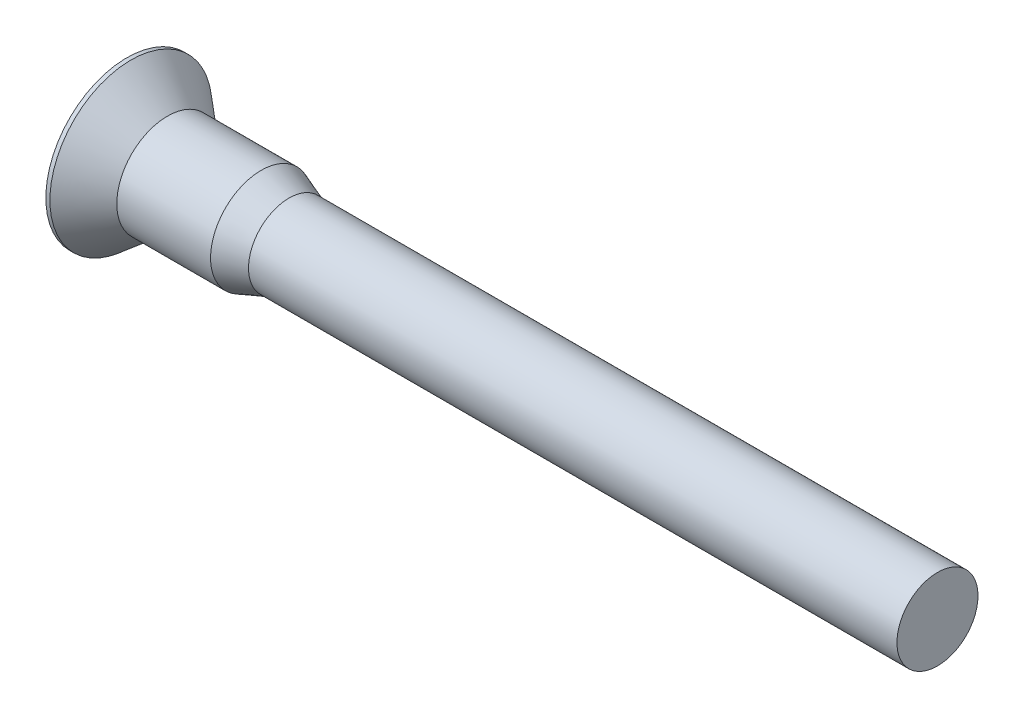
ISO-10303-21;
HEADER;
FILE_DESCRIPTION(('STEP AP214'),'2;1');
FILE_NAME('part.step','',(''),(''),'','','');
FILE_SCHEMA(('AUTOMOTIVE_DESIGN { 1 0 10303 214 1 1 1 1 }'));
ENDSEC;
DATA;
#1=APPLICATION_CONTEXT('core data for automotive mechanical design processes');
#2=APPLICATION_PROTOCOL_DEFINITION('international standard','automotive_design',2000,#1);
#3=PRODUCT_CONTEXT('',#1,'mechanical');
#4=PRODUCT('Part','Part','',(#3));
#5=PRODUCT_RELATED_PRODUCT_CATEGORY('part','',(#4));
#6=PRODUCT_DEFINITION_FORMATION('','',#4);
#7=PRODUCT_DEFINITION_CONTEXT('part definition',#1,'design');
#8=PRODUCT_DEFINITION('design','',#6,#7);
#9=PRODUCT_DEFINITION_SHAPE('','',#8);
#10=(LENGTH_UNIT() NAMED_UNIT(*) SI_UNIT(.MILLI.,.METRE.));
#11=(NAMED_UNIT(*) PLANE_ANGLE_UNIT() SI_UNIT($,.RADIAN.));
#12=(NAMED_UNIT(*) SI_UNIT($,.STERADIAN.) SOLID_ANGLE_UNIT());
#13=UNCERTAINTY_MEASURE_WITH_UNIT(LENGTH_MEASURE(1.E-05),#10,'distance_accuracy_value','');
#14=(GEOMETRIC_REPRESENTATION_CONTEXT(3) GLOBAL_UNCERTAINTY_ASSIGNED_CONTEXT((#13)) GLOBAL_UNIT_ASSIGNED_CONTEXT((#10,
#11,#12)) REPRESENTATION_CONTEXT('',''));
#15=CARTESIAN_POINT('',(0.,0.,0.));
#16=DIRECTION('',(0.,0.,1.));
#17=DIRECTION('',(1.,0.,0.));
#18=AXIS2_PLACEMENT_3D('',#15,#16,#17);
#19=CARTESIAN_POINT('',(0.,0.,0.));
#20=DIRECTION('',(-1.,0.,0.));
#21=DIRECTION('',(0.,0.,1.));
#22=AXIS2_PLACEMENT_3D('',#19,#20,#21);
#23=PLANE('',#22);
#24=DIRECTION('',(0.,0.999940500924261,-0.010908465122929));
#25=VECTOR('',#24,1.);
#26=CARTESIAN_POINT('',(0.,-1.13281490451861,2.01247701239886));
#27=LINE('',#26,#25);
#28=CARTESIAN_POINT('',(0.,-1.13281490451861,2.01247701239886));
#29=VERTEX_POINT('',#28);
#30=CARTESIAN_POINT('',(0.,1.17644876501032,1.98728499129818));
#31=VERTEX_POINT('',#30);
#32=EDGE_CURVE('E47',#29,#31,#27,.T.);
#33=ORIENTED_EDGE('',*,*,#32,.F.);
#34=DIRECTION('',(0.,0.509417258374883,0.860519643511883));
#35=VECTOR('',#34,1.);
#36=CARTESIAN_POINT('',(0.,-2.30926366952893,0.025192021100675));
#37=LINE('',#36,#35);
#38=CARTESIAN_POINT('',(0.,-2.30926366952893,0.025192021100675));
#39=VERTEX_POINT('',#38);
#40=EDGE_CURVE('E130',#39,#29,#37,.T.);
#41=ORIENTED_EDGE('',*,*,#40,.F.);
#42=DIRECTION('',(0.,-0.490523242549378,0.871428108634811));
#43=VECTOR('',#42,1.);
#44=CARTESIAN_POINT('',(0.,-1.17644876501032,-1.98728499129818));
#45=LINE('',#44,#43);
#46=CARTESIAN_POINT('',(0.,-1.17644876501032,-1.98728499129818));
#47=VERTEX_POINT('',#46);
#48=EDGE_CURVE('E128',#47,#39,#45,.T.);
#49=ORIENTED_EDGE('',*,*,#48,.F.);
#50=DIRECTION('',(0.,-0.999940500924261,0.0109084651229286));
#51=VECTOR('',#50,1.);
#52=CARTESIAN_POINT('',(0.,1.13281490451861,-2.01247701239886));
#53=LINE('',#52,#51);
#54=CARTESIAN_POINT('',(0.,1.13281490451861,-2.01247701239886));
#55=VERTEX_POINT('',#54);
#56=EDGE_CURVE('E95',#55,#47,#53,.T.);
#57=ORIENTED_EDGE('',*,*,#56,.F.);
#58=DIRECTION('',(0.,-0.509417258374883,-0.860519643511883));
#59=VECTOR('',#58,1.);
#60=CARTESIAN_POINT('',(0.,2.30926366952893,-0.0251920211006729));
#61=LINE('',#60,#59);
#62=CARTESIAN_POINT('',(0.,2.30926366952893,-0.0251920211006729));
#63=VERTEX_POINT('',#62);
#64=EDGE_CURVE('E124',#63,#55,#61,.T.);
#65=ORIENTED_EDGE('',*,*,#64,.F.);
#66=DIRECTION('',(0.,0.490523242549378,-0.871428108634811));
#67=VECTOR('',#66,1.);
#68=CARTESIAN_POINT('',(0.,1.17644876501032,1.98728499129818));
#69=LINE('',#68,#67);
#70=EDGE_CURVE('E121',#31,#63,#69,.T.);
#71=ORIENTED_EDGE('',*,*,#70,.F.);
#72=EDGE_LOOP('',(#33,#41,#49,#57,#65,#71));
#73=FACE_BOUND('',#72,.T.);
#74=CARTESIAN_POINT('',(0.,0.,0.));
#75=DIRECTION('',(1.,0.,0.));
#76=DIRECTION('',(0.,0.,-1.));
#77=AXIS2_PLACEMENT_3D('',#74,#75,#76);
#78=CIRCLE('',#77,4.);
#79=CARTESIAN_POINT('',(0.,0.,-4.));
#80=VERTEX_POINT('',#79);
#81=EDGE_CURVE('E11',#80,#80,#78,.T.);
#82=ORIENTED_EDGE('',*,*,#81,.F.);
#83=EDGE_LOOP('',(#82));
#84=FACE_BOUND('',#83,.T.);
#85=ADVANCED_FACE('F33',(#73,#84),#23,.T.);
#86=CARTESIAN_POINT('',(40.,0.,0.));
#87=DIRECTION('',(1.,0.,0.));
#88=DIRECTION('',(0.,0.,-1.));
#89=AXIS2_PLACEMENT_3D('',#86,#87,#88);
#90=CYLINDRICAL_SURFACE('',#89,4.);
#91=ORIENTED_EDGE('',*,*,#81,.T.);
#92=EDGE_LOOP('',(#91));
#93=FACE_BOUND('',#92,.T.);
#94=CARTESIAN_POINT('',(0.199999999999999,0.,0.));
#95=DIRECTION('',(1.,0.,0.));
#96=DIRECTION('',(0.,0.,-1.));
#97=AXIS2_PLACEMENT_3D('',#94,#95,#96);
#98=CIRCLE('',#97,4.);
#99=CARTESIAN_POINT('',(0.199999999999999,0.,-4.));
#100=VERTEX_POINT('',#99);
#101=EDGE_CURVE('E40',#100,#100,#98,.T.);
#102=ORIENTED_EDGE('',*,*,#101,.F.);
#103=EDGE_LOOP('',(#102));
#104=FACE_BOUND('',#103,.T.);
#105=ADVANCED_FACE('F156',(#93,#104),#90,.T.);
#106=CARTESIAN_POINT('',(2.,0.,0.));
#107=DIRECTION('',(-1.,0.,0.));
#108=DIRECTION('',(0.,0.,1.));
#109=AXIS2_PLACEMENT_3D('',#106,#107,#108);
#110=CONICAL_SURFACE('',#109,2.5,0.694738276196704);
#111=ORIENTED_EDGE('',*,*,#101,.T.);
#112=EDGE_LOOP('',(#111));
#113=FACE_BOUND('',#112,.T.);
#114=CARTESIAN_POINT('',(2.,0.,0.));
#115=DIRECTION('',(1.,0.,0.));
#116=DIRECTION('',(0.,0.,-1.));
#117=AXIS2_PLACEMENT_3D('',#114,#115,#116);
#118=CIRCLE('',#117,2.5);
#119=CARTESIAN_POINT('',(2.,0.,-2.5));
#120=VERTEX_POINT('',#119);
#121=EDGE_CURVE('E148',#120,#120,#118,.T.);
#122=ORIENTED_EDGE('',*,*,#121,.F.);
#123=EDGE_LOOP('',(#122));
#124=FACE_BOUND('',#123,.T.);
#125=ADVANCED_FACE('F153',(#113,#124),#110,.T.);
#126=CARTESIAN_POINT('',(40.,0.,0.));
#127=DIRECTION('',(1.,0.,0.));
#128=DIRECTION('',(0.,0.,-1.));
#129=AXIS2_PLACEMENT_3D('',#126,#127,#128);
#130=CYLINDRICAL_SURFACE('',#129,2.5);
#131=ORIENTED_EDGE('',*,*,#121,.T.);
#132=EDGE_LOOP('',(#131));
#133=FACE_BOUND('',#132,.T.);
#134=CARTESIAN_POINT('',(6.62767782195317,0.,0.));
#135=DIRECTION('',(1.,0.,0.));
#136=DIRECTION('',(0.,0.,-1.));
#137=AXIS2_PLACEMENT_3D('',#134,#135,#136);
#138=CIRCLE('',#137,2.5);
#139=CARTESIAN_POINT('',(6.62767782195317,0.,-2.5));
#140=VERTEX_POINT('',#139);
#141=EDGE_CURVE('E145',#140,#140,#138,.T.);
#142=ORIENTED_EDGE('',*,*,#141,.F.);
#143=EDGE_LOOP('',(#142));
#144=FACE_BOUND('',#143,.T.);
#145=ADVANCED_FACE('F163',(#133,#144),#130,.T.);
#146=CARTESIAN_POINT('',(8.,0.,0.));
#147=DIRECTION('',(-1.,0.,0.));
#148=DIRECTION('',(0.,0.,1.));
#149=AXIS2_PLACEMENT_3D('',#146,#147,#148);
#150=CONICAL_SURFACE('',#149,2.,0.349397557874134);
#151=ORIENTED_EDGE('',*,*,#141,.T.);
#152=EDGE_LOOP('',(#151));
#153=FACE_BOUND('',#152,.T.);
#154=CARTESIAN_POINT('',(8.,0.,0.));
#155=DIRECTION('',(1.,0.,0.));
#156=DIRECTION('',(0.,0.,-1.));
#157=AXIS2_PLACEMENT_3D('',#154,#155,#156);
#158=CIRCLE('',#157,2.);
#159=CARTESIAN_POINT('',(8.,0.,-2.));
#160=VERTEX_POINT('',#159);
#161=EDGE_CURVE('E142',#160,#160,#158,.T.);
#162=ORIENTED_EDGE('',*,*,#161,.F.);
#163=EDGE_LOOP('',(#162));
#164=FACE_BOUND('',#163,.T.);
#165=ADVANCED_FACE('F169',(#153,#164),#150,.T.);
#166=CARTESIAN_POINT('',(40.,0.,0.));
#167=DIRECTION('',(1.,0.,0.));
#168=DIRECTION('',(0.,0.,-1.));
#169=AXIS2_PLACEMENT_3D('',#166,#167,#168);
#170=CYLINDRICAL_SURFACE('',#169,2.);
#171=ORIENTED_EDGE('',*,*,#161,.T.);
#172=EDGE_LOOP('',(#171));
#173=FACE_BOUND('',#172,.T.);
#174=CARTESIAN_POINT('',(40.,0.,0.));
#175=DIRECTION('',(1.,0.,0.));
#176=DIRECTION('',(0.,0.,-1.));
#177=AXIS2_PLACEMENT_3D('',#174,#175,#176);
#178=CIRCLE('',#177,2.);
#179=CARTESIAN_POINT('',(40.,0.,-2.));
#180=VERTEX_POINT('',#179);
#181=EDGE_CURVE('E134',#180,#180,#178,.T.);
#182=ORIENTED_EDGE('',*,*,#181,.F.);
#183=EDGE_LOOP('',(#182));
#184=FACE_BOUND('',#183,.T.);
#185=ADVANCED_FACE('F173',(#173,#184),#170,.T.);
#186=CARTESIAN_POINT('',(40.,0.,-2.));
#187=DIRECTION('',(1.,0.,0.));
#188=DIRECTION('',(0.,0.,-1.));
#189=AXIS2_PLACEMENT_3D('',#186,#187,#188);
#190=PLANE('',#189);
#191=ORIENTED_EDGE('',*,*,#181,.T.);
#192=EDGE_LOOP('',(#191));
#193=FACE_BOUND('',#192,.T.);
#194=ADVANCED_FACE('F177',(#193),#190,.T.);
#195=CARTESIAN_POINT('',(2.,-1.13281490451861,2.01247701239886));
#196=DIRECTION('',(0.,0.010908465122929,0.999940500924261));
#197=DIRECTION('',(0.,-0.999940500924261,0.010908465122929));
#198=AXIS2_PLACEMENT_3D('',#195,#196,#197);
#199=PLANE('',#198);
#200=ORIENTED_EDGE('',*,*,#32,.T.);
#201=DIRECTION('',(-1.,0.,0.));
#202=VECTOR('',#201,1.);
#203=CARTESIAN_POINT('',(2.,1.17644876501032,1.98728499129818));
#204=LINE('',#203,#202);
#205=CARTESIAN_POINT('',(2.,1.17644876501032,1.98728499129818));
#206=VERTEX_POINT('',#205);
#207=EDGE_CURVE('E77',#206,#31,#204,.T.);
#208=ORIENTED_EDGE('',*,*,#207,.F.);
#209=DIRECTION('',(0.,0.999940500924261,-0.010908465122929));
#210=VECTOR('',#209,1.);
#211=CARTESIAN_POINT('',(2.,-1.13281490451861,2.01247701239886));
#212=LINE('',#211,#210);
#213=CARTESIAN_POINT('',(2.,-1.13281490451861,2.01247701239886));
#214=VERTEX_POINT('',#213);
#215=EDGE_CURVE('E132',#214,#206,#212,.T.);
#216=ORIENTED_EDGE('',*,*,#215,.F.);
#217=DIRECTION('',(-1.,0.,0.));
#218=VECTOR('',#217,1.);
#219=CARTESIAN_POINT('',(2.,-1.13281490451861,2.01247701239886));
#220=LINE('',#219,#218);
#221=EDGE_CURVE('E55',#214,#29,#220,.T.);
#222=ORIENTED_EDGE('',*,*,#221,.T.);
#223=EDGE_LOOP('',(#200,#208,#216,#222));
#224=FACE_BOUND('',#223,.T.);
#225=ADVANCED_FACE('F181',(#224),#199,.F.);
#226=CARTESIAN_POINT('',(2.,-2.30926366952893,0.0251920211006748));
#227=DIRECTION('',(0.,-0.860519643511883,0.509417258374883));
#228=DIRECTION('',(0.,-0.509417258374883,-0.860519643511883));
#229=AXIS2_PLACEMENT_3D('',#226,#227,#228);
#230=PLANE('',#229);
#231=ORIENTED_EDGE('',*,*,#40,.T.);
#232=ORIENTED_EDGE('',*,*,#221,.F.);
#233=DIRECTION('',(0.,0.509417258374883,0.860519643511883));
#234=VECTOR('',#233,1.);
#235=CARTESIAN_POINT('',(2.,-2.30926366952893,0.0251920211006748));
#236=LINE('',#235,#234);
#237=CARTESIAN_POINT('',(2.,-2.30926366952893,0.0251920211006748));
#238=VERTEX_POINT('',#237);
#239=EDGE_CURVE('E107',#238,#214,#236,.T.);
#240=ORIENTED_EDGE('',*,*,#239,.F.);
#241=DIRECTION('',(-1.,0.,0.));
#242=VECTOR('',#241,1.);
#243=CARTESIAN_POINT('',(2.,-2.30926366952893,0.0251920211006748));
#244=LINE('',#243,#242);
#245=EDGE_CURVE('E99',#238,#39,#244,.T.);
#246=ORIENTED_EDGE('',*,*,#245,.T.);
#247=EDGE_LOOP('',(#231,#232,#240,#246));
#248=FACE_BOUND('',#247,.T.);
#249=ADVANCED_FACE('F185',(#248),#230,.F.);
#250=CARTESIAN_POINT('',(2.,-1.17644876501032,-1.98728499129818));
#251=DIRECTION('',(0.,-0.871428108634811,-0.490523242549378));
#252=DIRECTION('',(0.,0.490523242549378,-0.871428108634811));
#253=AXIS2_PLACEMENT_3D('',#250,#251,#252);
#254=PLANE('',#253);
#255=ORIENTED_EDGE('',*,*,#48,.T.);
#256=ORIENTED_EDGE('',*,*,#245,.F.);
#257=DIRECTION('',(0.,-0.490523242549378,0.871428108634811));
#258=VECTOR('',#257,1.);
#259=CARTESIAN_POINT('',(2.,-1.17644876501032,-1.98728499129818));
#260=LINE('',#259,#258);
#261=CARTESIAN_POINT('',(2.,-1.17644876501032,-1.98728499129818));
#262=VERTEX_POINT('',#261);
#263=EDGE_CURVE('E103',#262,#238,#260,.T.);
#264=ORIENTED_EDGE('',*,*,#263,.F.);
#265=DIRECTION('',(-1.,0.,0.));
#266=VECTOR('',#265,1.);
#267=CARTESIAN_POINT('',(2.,-1.17644876501032,-1.98728499129818));
#268=LINE('',#267,#266);
#269=EDGE_CURVE('E88',#262,#47,#268,.T.);
#270=ORIENTED_EDGE('',*,*,#269,.T.);
#271=EDGE_LOOP('',(#255,#256,#264,#270));
#272=FACE_BOUND('',#271,.T.);
#273=ADVANCED_FACE('F104',(#272),#254,.F.);
#274=CARTESIAN_POINT('',(2.,1.13281490451861,-2.01247701239886));
#275=DIRECTION('',(0.,-0.0109084651229286,-0.999940500924261));
#276=DIRECTION('',(0.,0.999940500924261,-0.0109084651229286));
#277=AXIS2_PLACEMENT_3D('',#274,#275,#276);
#278=PLANE('',#277);
#279=ORIENTED_EDGE('',*,*,#56,.T.);
#280=ORIENTED_EDGE('',*,*,#269,.F.);
#281=DIRECTION('',(0.,-0.999940500924261,0.0109084651229286));
#282=VECTOR('',#281,1.);
#283=CARTESIAN_POINT('',(2.,1.13281490451861,-2.01247701239886));
#284=LINE('',#283,#282);
#285=CARTESIAN_POINT('',(2.,1.13281490451861,-2.01247701239886));
#286=VERTEX_POINT('',#285);
#287=EDGE_CURVE('E92',#286,#262,#284,.T.);
#288=ORIENTED_EDGE('',*,*,#287,.F.);
#289=DIRECTION('',(-1.,0.,0.));
#290=VECTOR('',#289,1.);
#291=CARTESIAN_POINT('',(2.,1.13281490451861,-2.01247701239886));
#292=LINE('',#291,#290);
#293=EDGE_CURVE('E100',#286,#55,#292,.T.);
#294=ORIENTED_EDGE('',*,*,#293,.T.);
#295=EDGE_LOOP('',(#279,#280,#288,#294));
#296=FACE_BOUND('',#295,.T.);
#297=ADVANCED_FACE('F90',(#296),#278,.F.);
#298=CARTESIAN_POINT('',(2.,2.30926366952893,-0.0251920211006731));
#299=DIRECTION('',(0.,0.860519643511883,-0.509417258374883));
#300=DIRECTION('',(0.,0.509417258374883,0.860519643511883));
#301=AXIS2_PLACEMENT_3D('',#298,#299,#300);
#302=PLANE('',#301);
#303=ORIENTED_EDGE('',*,*,#64,.T.);
#304=ORIENTED_EDGE('',*,*,#293,.F.);
#305=DIRECTION('',(0.,-0.509417258374883,-0.860519643511883));
#306=VECTOR('',#305,1.);
#307=CARTESIAN_POINT('',(2.,2.30926366952893,-0.0251920211006731));
#308=LINE('',#307,#306);
#309=CARTESIAN_POINT('',(2.,2.30926366952893,-0.0251920211006731));
#310=VERTEX_POINT('',#309);
#311=EDGE_CURVE('E113',#310,#286,#308,.T.);
#312=ORIENTED_EDGE('',*,*,#311,.F.);
#313=DIRECTION('',(-1.,0.,0.));
#314=VECTOR('',#313,1.);
#315=CARTESIAN_POINT('',(2.,2.30926366952893,-0.0251920211006731));
#316=LINE('',#315,#314);
#317=EDGE_CURVE('E137',#310,#63,#316,.T.);
#318=ORIENTED_EDGE('',*,*,#317,.T.);
#319=EDGE_LOOP('',(#303,#304,#312,#318));
#320=FACE_BOUND('',#319,.T.);
#321=ADVANCED_FACE('F189',(#320),#302,.F.);
#322=CARTESIAN_POINT('',(2.,1.17644876501032,1.98728499129818));
#323=DIRECTION('',(0.,0.871428108634811,0.490523242549378));
#324=DIRECTION('',(0.,-0.490523242549378,0.871428108634811));
#325=AXIS2_PLACEMENT_3D('',#322,#323,#324);
#326=PLANE('',#325);
#327=ORIENTED_EDGE('',*,*,#70,.T.);
#328=ORIENTED_EDGE('',*,*,#317,.F.);
#329=DIRECTION('',(0.,0.490523242549378,-0.871428108634811));
#330=VECTOR('',#329,1.);
#331=CARTESIAN_POINT('',(2.,1.17644876501032,1.98728499129818));
#332=LINE('',#331,#330);
#333=EDGE_CURVE('E115',#206,#310,#332,.T.);
#334=ORIENTED_EDGE('',*,*,#333,.F.);
#335=ORIENTED_EDGE('',*,*,#207,.T.);
#336=EDGE_LOOP('',(#327,#328,#334,#335));
#337=FACE_BOUND('',#336,.T.);
#338=ADVANCED_FACE('F186',(#337),#326,.F.);
#339=CARTESIAN_POINT('',(2.,0.,0.));
#340=DIRECTION('',(-1.,0.,0.));
#341=DIRECTION('',(0.,0.,1.));
#342=AXIS2_PLACEMENT_3D('',#339,#340,#341);
#343=PLANE('',#342);
#344=ORIENTED_EDGE('',*,*,#215,.T.);
#345=ORIENTED_EDGE('',*,*,#333,.T.);
#346=ORIENTED_EDGE('',*,*,#311,.T.);
#347=ORIENTED_EDGE('',*,*,#287,.T.);
#348=ORIENTED_EDGE('',*,*,#263,.T.);
#349=ORIENTED_EDGE('',*,*,#239,.T.);
#350=EDGE_LOOP('',(#344,#345,#346,#347,#348,#349));
#351=FACE_BOUND('',#350,.T.);
#352=ADVANCED_FACE('F110',(#351),#343,.T.);
#353=CLOSED_SHELL('',(#85,#105,#125,#145,#165,#185,#194,#225,#249,#273,#297,#321,#338,#352));
#354=MANIFOLD_SOLID_BREP('B2',#353);
#355=ADVANCED_BREP_SHAPE_REPRESENTATION('',(#18,#354),#14);
#356=SHAPE_DEFINITION_REPRESENTATION(#9,#355);
ENDSEC;
END-ISO-10303-21;
